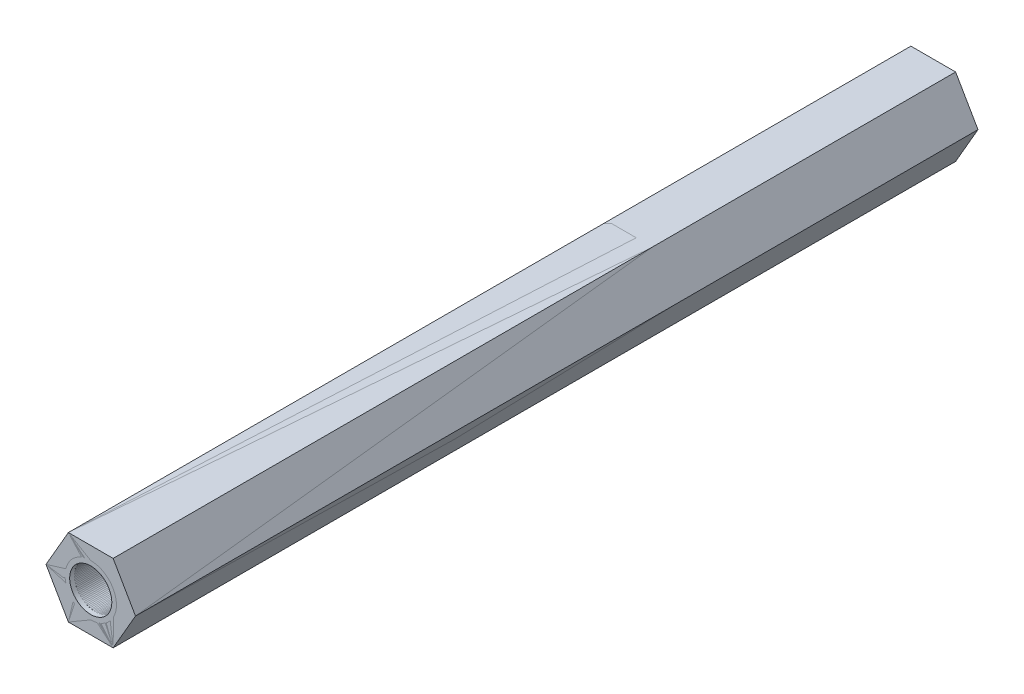
ISO-10303-21;
HEADER;
FILE_DESCRIPTION(('STEP AP214'),'2;1');
FILE_NAME('part.step','',(''),(''),'','','');
FILE_SCHEMA(('AUTOMOTIVE_DESIGN { 1 0 10303 214 1 1 1 1 }'));
ENDSEC;
DATA;
#1=APPLICATION_CONTEXT('core data for automotive mechanical design processes');
#2=APPLICATION_PROTOCOL_DEFINITION('international standard','automotive_design',2000,#1);
#3=PRODUCT_CONTEXT('',#1,'mechanical');
#4=PRODUCT('Part','Part','',(#3));
#5=PRODUCT_RELATED_PRODUCT_CATEGORY('part','',(#4));
#6=PRODUCT_DEFINITION_FORMATION('','',#4);
#7=PRODUCT_DEFINITION_CONTEXT('part definition',#1,'design');
#8=PRODUCT_DEFINITION('design','',#6,#7);
#9=PRODUCT_DEFINITION_SHAPE('','',#8);
#10=(LENGTH_UNIT() NAMED_UNIT(*) SI_UNIT(.MILLI.,.METRE.));
#11=(NAMED_UNIT(*) PLANE_ANGLE_UNIT() SI_UNIT($,.RADIAN.));
#12=(NAMED_UNIT(*) SI_UNIT($,.STERADIAN.) SOLID_ANGLE_UNIT());
#13=UNCERTAINTY_MEASURE_WITH_UNIT(LENGTH_MEASURE(1.E-05),#10,'distance_accuracy_value','');
#14=(GEOMETRIC_REPRESENTATION_CONTEXT(3) GLOBAL_UNCERTAINTY_ASSIGNED_CONTEXT((#13)) GLOBAL_UNIT_ASSIGNED_CONTEXT((#10,
#11,#12)) REPRESENTATION_CONTEXT('',''));
#15=CARTESIAN_POINT('',(0.,0.,0.));
#16=DIRECTION('',(0.,0.,1.));
#17=DIRECTION('',(1.,0.,0.));
#18=AXIS2_PLACEMENT_3D('',#15,#16,#17);
#19=CARTESIAN_POINT('',(0.,0.,15.475));
#20=DIRECTION('',(0.,0.,1.));
#21=DIRECTION('',(-1.,0.,0.));
#22=AXIS2_PLACEMENT_3D('',#19,#20,#21);
#23=CONICAL_SURFACE('',#22,1.00000000000004,0.78539816339747);
#24=DIRECTION('',(0.707106781186548,0.,0.707106781186548));
#25=VECTOR('',#24,1.);
#26=CARTESIAN_POINT('',(1.25,0.,15.725));
#27=LINE('',#26,#25);
#28=CARTESIAN_POINT('',(1.25,0.,15.725));
#29=VERTEX_POINT('',#28);
#30=CARTESIAN_POINT('',(1.525,0.,16.));
#31=VERTEX_POINT('',#30);
#32=EDGE_CURVE('P0_E172',#29,#31,#27,.T.);
#33=ORIENTED_EDGE('',*,*,#32,.F.);
#34=CARTESIAN_POINT('',(0.,0.,15.725));
#35=DIRECTION('',(0.,0.,1.));
#36=DIRECTION('',(-1.,0.,0.));
#37=AXIS2_PLACEMENT_3D('',#34,#35,#36);
#38=CIRCLE('',#37,1.25);
#39=CARTESIAN_POINT('',(-1.25,0.,15.725));
#40=VERTEX_POINT('',#39);
#41=EDGE_CURVE('P0_E183',#40,#29,#38,.T.);
#42=ORIENTED_EDGE('',*,*,#41,.F.);
#43=DIRECTION('',(0.707106781186548,0.,-0.707106781186548));
#44=VECTOR('',#43,1.);
#45=CARTESIAN_POINT('',(-1.525,0.,16.));
#46=LINE('',#45,#44);
#47=CARTESIAN_POINT('',(-1.525,0.,16.));
#48=VERTEX_POINT('',#47);
#49=EDGE_CURVE('P0_E179',#48,#40,#46,.T.);
#50=ORIENTED_EDGE('',*,*,#49,.F.);
#51=CARTESIAN_POINT('',(0.,0.,16.));
#52=DIRECTION('',(0.,0.,-1.));
#53=DIRECTION('',(1.,0.,0.));
#54=AXIS2_PLACEMENT_3D('',#51,#52,#53);
#55=CIRCLE('',#54,1.525);
#56=EDGE_CURVE('P0_E218',#31,#48,#55,.T.);
#57=ORIENTED_EDGE('',*,*,#56,.F.);
#58=EDGE_LOOP('',(#33,#42,#50,#57));
#59=FACE_BOUND('',#58,.T.);
#60=ADVANCED_FACE('P0_F17',(#59),#23,.F.);
#61=CARTESIAN_POINT('',(0.,0.,15.725));
#62=DIRECTION('',(0.,0.,-1.));
#63=DIRECTION('',(-0.999999999999514,9.85398092523794E-07,0.));
#64=AXIS2_PLACEMENT_3D('',#61,#62,#63);
#65=CYLINDRICAL_SURFACE('',#64,1.25);
#66=DIRECTION('',(0.,0.,-1.));
#67=VECTOR('',#66,1.);
#68=CARTESIAN_POINT('',(1.25,0.,15.725));
#69=LINE('',#68,#67);
#70=CARTESIAN_POINT('',(1.25,0.,3.5));
#71=VERTEX_POINT('',#70);
#72=EDGE_CURVE('P0_E187',#29,#71,#69,.T.);
#73=ORIENTED_EDGE('',*,*,#72,.F.);
#74=CARTESIAN_POINT('',(0.,0.,15.725));
#75=DIRECTION('',(0.,0.,-1.));
#76=DIRECTION('',(-1.,0.,0.));
#77=AXIS2_PLACEMENT_3D('',#74,#75,#76);
#78=CIRCLE('',#77,1.25);
#79=EDGE_CURVE('P0_E170',#40,#29,#78,.T.);
#80=ORIENTED_EDGE('',*,*,#79,.F.);
#81=DIRECTION('',(0.,0.,1.));
#82=VECTOR('',#81,1.);
#83=CARTESIAN_POINT('',(-1.25,0.,3.5));
#84=LINE('',#83,#82);
#85=CARTESIAN_POINT('',(-1.25,0.,3.5));
#86=VERTEX_POINT('',#85);
#87=EDGE_CURVE('P0_E203',#86,#40,#84,.T.);
#88=ORIENTED_EDGE('',*,*,#87,.F.);
#89=CARTESIAN_POINT('',(0.,0.,3.5));
#90=DIRECTION('',(0.,0.,1.));
#91=DIRECTION('',(1.,0.,0.));
#92=AXIS2_PLACEMENT_3D('',#89,#90,#91);
#93=CIRCLE('',#92,1.25);
#94=EDGE_CURVE('P0_E209',#71,#86,#93,.T.);
#95=ORIENTED_EDGE('',*,*,#94,.F.);
#96=EDGE_LOOP('',(#73,#80,#88,#95));
#97=FACE_BOUND('',#96,.T.);
#98=ADVANCED_FACE('P0_F467',(#97),#65,.F.);
#99=CARTESIAN_POINT('',(0.,0.,3.7489242262156));
#100=DIRECTION('',(0.,0.,1.));
#101=DIRECTION('',(-1.,0.,0.));
#102=AXIS2_PLACEMENT_3D('',#99,#100,#101);
#103=CONICAL_SURFACE('',#102,1.66427948235069,1.0297442586767);
#104=DIRECTION('',(0.857167300702128,0.,0.515038074910029));
#105=VECTOR('',#104,1.);
#106=CARTESIAN_POINT('',(0.,0.,2.7489242262156));
#107=LINE('',#106,#105);
#108=CARTESIAN_POINT('',(0.,0.,2.7489242262156));
#109=VERTEX_POINT('',#108);
#110=EDGE_CURVE('P0_E202',#109,#71,#107,.T.);
#111=ORIENTED_EDGE('',*,*,#110,.F.);
#112=DIRECTION('',(0.857167300702128,0.,-0.515038074910029));
#113=VECTOR('',#112,1.);
#114=CARTESIAN_POINT('',(-1.25,0.,3.5));
#115=LINE('',#114,#113);
#116=EDGE_CURVE('P0_E198',#86,#109,#115,.T.);
#117=ORIENTED_EDGE('',*,*,#116,.F.);
#118=CARTESIAN_POINT('',(0.,0.,3.5));
#119=DIRECTION('',(0.,0.,-1.));
#120=DIRECTION('',(1.,0.,0.));
#121=AXIS2_PLACEMENT_3D('',#118,#119,#120);
#122=CIRCLE('',#121,1.25);
#123=EDGE_CURVE('P0_E197',#71,#86,#122,.T.);
#124=ORIENTED_EDGE('',*,*,#123,.F.);
#125=EDGE_LOOP('',(#111,#117,#124));
#126=FACE_BOUND('',#125,.T.);
#127=ADVANCED_FACE('P0_F472',(#126),#103,.F.);
#128=CARTESIAN_POINT('',(0.,0.,-15.475));
#129=DIRECTION('',(0.,0.,-1.));
#130=DIRECTION('',(1.,0.,0.));
#131=AXIS2_PLACEMENT_3D('',#128,#129,#130);
#132=CONICAL_SURFACE('',#131,1.00000000000004,0.78539816339747);
#133=DIRECTION('',(-0.707106781186548,0.,-0.707106781186548));
#134=VECTOR('',#133,1.);
#135=CARTESIAN_POINT('',(-1.25,0.,-15.725));
#136=LINE('',#135,#134);
#137=CARTESIAN_POINT('',(-1.25,0.,-15.725));
#138=VERTEX_POINT('',#137);
#139=CARTESIAN_POINT('',(-1.525,0.,-16.));
#140=VERTEX_POINT('',#139);
#141=EDGE_CURVE('P0_E159',#138,#140,#136,.T.);
#142=ORIENTED_EDGE('',*,*,#141,.F.);
#143=CARTESIAN_POINT('',(0.,0.,-15.725));
#144=DIRECTION('',(0.,0.,-1.));
#145=DIRECTION('',(1.,0.,0.));
#146=AXIS2_PLACEMENT_3D('',#143,#144,#145);
#147=CIRCLE('',#146,1.25);
#148=CARTESIAN_POINT('',(1.25,0.,-15.725));
#149=VERTEX_POINT('',#148);
#150=EDGE_CURVE('P0_E152',#149,#138,#147,.T.);
#151=ORIENTED_EDGE('',*,*,#150,.F.);
#152=DIRECTION('',(-0.707106781186548,0.,0.707106781186548));
#153=VECTOR('',#152,1.);
#154=CARTESIAN_POINT('',(1.525,0.,-16.));
#155=LINE('',#154,#153);
#156=CARTESIAN_POINT('',(1.525,0.,-16.));
#157=VERTEX_POINT('',#156);
#158=EDGE_CURVE('P0_E149',#157,#149,#155,.T.);
#159=ORIENTED_EDGE('',*,*,#158,.F.);
#160=CARTESIAN_POINT('',(0.,0.,-16.));
#161=DIRECTION('',(0.,0.,1.));
#162=DIRECTION('',(-1.,0.,0.));
#163=AXIS2_PLACEMENT_3D('',#160,#161,#162);
#164=CIRCLE('',#163,1.525);
#165=EDGE_CURVE('P0_E11',#140,#157,#164,.T.);
#166=ORIENTED_EDGE('',*,*,#165,.F.);
#167=EDGE_LOOP('',(#142,#151,#159,#166));
#168=FACE_BOUND('',#167,.T.);
#169=ADVANCED_FACE('P0_F150',(#168),#132,.F.);
#170=CARTESIAN_POINT('',(0.,0.,-15.725));
#171=DIRECTION('',(0.,0.,1.));
#172=DIRECTION('',(0.999999999999514,9.85398092523794E-07,0.));
#173=AXIS2_PLACEMENT_3D('',#170,#171,#172);
#174=CYLINDRICAL_SURFACE('',#173,1.25);
#175=DIRECTION('',(0.,0.,1.));
#176=VECTOR('',#175,1.);
#177=CARTESIAN_POINT('',(-1.25,0.,-15.725));
#178=LINE('',#177,#176);
#179=CARTESIAN_POINT('',(-1.25,0.,-3.5));
#180=VERTEX_POINT('',#179);
#181=EDGE_CURVE('P0_E214',#138,#180,#178,.T.);
#182=ORIENTED_EDGE('',*,*,#181,.F.);
#183=CARTESIAN_POINT('',(0.,0.,-15.725));
#184=DIRECTION('',(0.,0.,1.));
#185=DIRECTION('',(1.,0.,0.));
#186=AXIS2_PLACEMENT_3D('',#183,#184,#185);
#187=CIRCLE('',#186,1.25);
#188=EDGE_CURVE('P0_E166',#149,#138,#187,.T.);
#189=ORIENTED_EDGE('',*,*,#188,.F.);
#190=DIRECTION('',(0.,0.,-1.));
#191=VECTOR('',#190,1.);
#192=CARTESIAN_POINT('',(1.25,0.,-3.5));
#193=LINE('',#192,#191);
#194=CARTESIAN_POINT('',(1.25,0.,-3.5));
#195=VERTEX_POINT('',#194);
#196=EDGE_CURVE('P0_E232',#195,#149,#193,.T.);
#197=ORIENTED_EDGE('',*,*,#196,.F.);
#198=CARTESIAN_POINT('',(0.,0.,-3.5));
#199=DIRECTION('',(0.,0.,-1.));
#200=DIRECTION('',(-1.,0.,0.));
#201=AXIS2_PLACEMENT_3D('',#198,#199,#200);
#202=CIRCLE('',#201,1.25);
#203=EDGE_CURVE('P0_E243',#180,#195,#202,.T.);
#204=ORIENTED_EDGE('',*,*,#203,.F.);
#205=EDGE_LOOP('',(#182,#189,#197,#204));
#206=FACE_BOUND('',#205,.T.);
#207=ADVANCED_FACE('P0_F432',(#206),#174,.F.);
#208=CARTESIAN_POINT('',(0.,0.,-3.7489242262156));
#209=DIRECTION('',(0.,0.,-1.));
#210=DIRECTION('',(1.,0.,0.));
#211=AXIS2_PLACEMENT_3D('',#208,#209,#210);
#212=CONICAL_SURFACE('',#211,1.66427948235069,1.0297442586767);
#213=DIRECTION('',(-0.857167300702128,0.,-0.515038074910029));
#214=VECTOR('',#213,1.);
#215=CARTESIAN_POINT('',(0.,0.,-2.7489242262156));
#216=LINE('',#215,#214);
#217=CARTESIAN_POINT('',(0.,0.,-2.7489242262156));
#218=VERTEX_POINT('',#217);
#219=EDGE_CURVE('P0_E239',#218,#180,#216,.T.);
#220=ORIENTED_EDGE('',*,*,#219,.F.);
#221=DIRECTION('',(-0.857167300702128,0.,0.515038074910029));
#222=VECTOR('',#221,1.);
#223=CARTESIAN_POINT('',(1.25,0.,-3.5));
#224=LINE('',#223,#222);
#225=EDGE_CURVE('P0_E235',#195,#218,#224,.T.);
#226=ORIENTED_EDGE('',*,*,#225,.F.);
#227=CARTESIAN_POINT('',(0.,0.,-3.5));
#228=DIRECTION('',(0.,0.,1.));
#229=DIRECTION('',(-1.,0.,0.));
#230=AXIS2_PLACEMENT_3D('',#227,#228,#229);
#231=CIRCLE('',#230,1.25);
#232=EDGE_CURVE('P0_E222',#180,#195,#231,.T.);
#233=ORIENTED_EDGE('',*,*,#232,.F.);
#234=EDGE_LOOP('',(#220,#226,#233));
#235=FACE_BOUND('',#234,.T.);
#236=ADVANCED_FACE('P0_F391',(#235),#212,.F.);
#237=CARTESIAN_POINT('',(0.,0.,-16.));
#238=DIRECTION('',(0.,0.,-1.));
#239=DIRECTION('',(0.,-1.,0.));
#240=AXIS2_PLACEMENT_3D('',#237,#238,#239);
#241=PLANE('',#240);
#242=CARTESIAN_POINT('',(0.,0.,-16.));
#243=DIRECTION('',(0.,0.,-1.));
#244=DIRECTION('',(-1.,0.,0.));
#245=AXIS2_PLACEMENT_3D('',#242,#243,#244);
#246=CIRCLE('',#245,1.525);
#247=EDGE_CURVE('P0_E143',#140,#157,#246,.T.);
#248=ORIENTED_EDGE('',*,*,#247,.F.);
#249=ORIENTED_EDGE('',*,*,#165,.T.);
#250=EDGE_LOOP('',(#248,#249));
#251=FACE_BOUND('',#250,.T.);
#252=DIRECTION('',(0.499999999999988,0.866025403784446,0.));
#253=VECTOR('',#252,1.);
#254=CARTESIAN_POINT('',(1.3279056191362,-2.3,-16.));
#255=LINE('',#254,#253);
#256=CARTESIAN_POINT('',(1.3279056191362,-2.3,-16.));
#257=VERTEX_POINT('',#256);
#258=CARTESIAN_POINT('',(2.6558112382723,0.,-16.));
#259=VERTEX_POINT('',#258);
#260=EDGE_CURVE('P0_E281',#257,#259,#255,.T.);
#261=ORIENTED_EDGE('',*,*,#260,.F.);
#262=DIRECTION('',(1.,0.,0.));
#263=VECTOR('',#262,1.);
#264=CARTESIAN_POINT('',(-1.3279056191361,-2.3,-16.));
#265=LINE('',#264,#263);
#266=CARTESIAN_POINT('',(-1.3279056191361,-2.3,-16.));
#267=VERTEX_POINT('',#266);
#268=EDGE_CURVE('P0_E249',#267,#257,#265,.T.);
#269=ORIENTED_EDGE('',*,*,#268,.F.);
#270=DIRECTION('',(0.500000000000019,-0.866025403784428,0.));
#271=VECTOR('',#270,1.);
#272=CARTESIAN_POINT('',(-2.6558112382723,0.,-16.));
#273=LINE('',#272,#271);
#274=CARTESIAN_POINT('',(-2.6558112382723,0.,-16.));
#275=VERTEX_POINT('',#274);
#276=EDGE_CURVE('P0_E272',#275,#267,#273,.T.);
#277=ORIENTED_EDGE('',*,*,#276,.F.);
#278=DIRECTION('',(-0.500000000000011,-0.866025403784432,0.));
#279=VECTOR('',#278,1.);
#280=CARTESIAN_POINT('',(-1.3279056191361,2.3,-16.));
#281=LINE('',#280,#279);
#282=CARTESIAN_POINT('',(-1.3279056191361,2.3,-16.));
#283=VERTEX_POINT('',#282);
#284=EDGE_CURVE('P0_E20',#283,#275,#281,.T.);
#285=ORIENTED_EDGE('',*,*,#284,.F.);
#286=DIRECTION('',(-1.,0.,0.));
#287=VECTOR('',#286,1.);
#288=CARTESIAN_POINT('',(1.3279056191361,2.3,-16.));
#289=LINE('',#288,#287);
#290=CARTESIAN_POINT('',(1.3279056191361,2.3,-16.));
#291=VERTEX_POINT('',#290);
#292=EDGE_CURVE('P0_E43',#291,#283,#289,.T.);
#293=ORIENTED_EDGE('',*,*,#292,.F.);
#294=DIRECTION('',(-0.500000000000019,0.866025403784428,0.));
#295=VECTOR('',#294,1.);
#296=CARTESIAN_POINT('',(2.6558112382723,0.,-16.));
#297=LINE('',#296,#295);
#298=EDGE_CURVE('P0_E223',#259,#291,#297,.T.);
#299=ORIENTED_EDGE('',*,*,#298,.F.);
#300=EDGE_LOOP('',(#261,#269,#277,#285,#293,#299));
#301=FACE_BOUND('',#300,.T.);
#302=ADVANCED_FACE('P0_F141',(#251,#301),#241,.T.);
#303=CARTESIAN_POINT('',(-1.9918584287042,1.15,0.));
#304=DIRECTION('',(-0.866025403784439,0.5,0.));
#305=DIRECTION('',(0.,0.,1.));
#306=AXIS2_PLACEMENT_3D('',#303,#304,#305);
#307=PLANE('',#306);
#308=ORIENTED_EDGE('',*,*,#284,.T.);
#309=DIRECTION('',(0.,0.,-1.));
#310=VECTOR('',#309,1.);
#311=CARTESIAN_POINT('',(-2.6558112382723,0.,16.));
#312=LINE('',#311,#310);
#313=CARTESIAN_POINT('',(-2.6558112382723,0.,16.));
#314=VERTEX_POINT('',#313);
#315=EDGE_CURVE('P0_E275',#314,#275,#312,.T.);
#316=ORIENTED_EDGE('',*,*,#315,.F.);
#317=DIRECTION('',(-0.500000000000011,-0.866025403784432,0.));
#318=VECTOR('',#317,1.);
#319=CARTESIAN_POINT('',(-1.3279056191361,2.3,16.));
#320=LINE('',#319,#318);
#321=CARTESIAN_POINT('',(-1.3279056191361,2.3,16.));
#322=VERTEX_POINT('',#321);
#323=EDGE_CURVE('P0_E192',#322,#314,#320,.T.);
#324=ORIENTED_EDGE('',*,*,#323,.F.);
#325=DIRECTION('',(0.,0.,1.));
#326=VECTOR('',#325,1.);
#327=CARTESIAN_POINT('',(-1.3279056191361,2.3,-16.));
#328=LINE('',#327,#326);
#329=EDGE_CURVE('P0_E289',#283,#322,#328,.T.);
#330=ORIENTED_EDGE('',*,*,#329,.F.);
#331=EDGE_LOOP('',(#308,#316,#324,#330));
#332=FACE_BOUND('',#331,.T.);
#333=ADVANCED_FACE('P0_F314',(#332),#307,.T.);
#334=CARTESIAN_POINT('',(0.,2.3,0.));
#335=DIRECTION('',(0.,1.,0.));
#336=DIRECTION('',(1.,0.,0.));
#337=AXIS2_PLACEMENT_3D('',#334,#335,#336);
#338=PLANE('',#337);
#339=ORIENTED_EDGE('',*,*,#292,.T.);
#340=ORIENTED_EDGE('',*,*,#329,.T.);
#341=DIRECTION('',(-1.,0.,0.));
#342=VECTOR('',#341,1.);
#343=CARTESIAN_POINT('',(1.3279056191361,2.3,16.));
#344=LINE('',#343,#342);
#345=CARTESIAN_POINT('',(1.3279056191361,2.3,16.));
#346=VERTEX_POINT('',#345);
#347=EDGE_CURVE('P0_E188',#346,#322,#344,.T.);
#348=ORIENTED_EDGE('',*,*,#347,.F.);
#349=DIRECTION('',(0.,0.,1.));
#350=VECTOR('',#349,1.);
#351=CARTESIAN_POINT('',(1.3279056191361,2.3,-16.));
#352=LINE('',#351,#350);
#353=EDGE_CURVE('P0_E227',#291,#346,#352,.T.);
#354=ORIENTED_EDGE('',*,*,#353,.F.);
#355=EDGE_LOOP('',(#339,#340,#348,#354));
#356=FACE_BOUND('',#355,.T.);
#357=ADVANCED_FACE('P0_F295',(#356),#338,.T.);
#358=CARTESIAN_POINT('',(1.9918584287042,1.15,0.));
#359=DIRECTION('',(0.866025403784439,0.5,0.));
#360=DIRECTION('',(0.,0.,-1.));
#361=AXIS2_PLACEMENT_3D('',#358,#359,#360);
#362=PLANE('',#361);
#363=ORIENTED_EDGE('',*,*,#298,.T.);
#364=ORIENTED_EDGE('',*,*,#353,.T.);
#365=DIRECTION('',(-0.500000000000019,0.866025403784428,0.));
#366=VECTOR('',#365,1.);
#367=CARTESIAN_POINT('',(2.6558112382723,0.,16.));
#368=LINE('',#367,#366);
#369=CARTESIAN_POINT('',(2.6558112382723,0.,16.));
#370=VERTEX_POINT('',#369);
#371=EDGE_CURVE('P0_E193',#370,#346,#368,.T.);
#372=ORIENTED_EDGE('',*,*,#371,.F.);
#373=DIRECTION('',(0.,0.,1.));
#374=VECTOR('',#373,1.);
#375=CARTESIAN_POINT('',(2.6558112382723,0.,-16.));
#376=LINE('',#375,#374);
#377=EDGE_CURVE('P0_E228',#259,#370,#376,.T.);
#378=ORIENTED_EDGE('',*,*,#377,.F.);
#379=EDGE_LOOP('',(#363,#364,#372,#378));
#380=FACE_BOUND('',#379,.T.);
#381=ADVANCED_FACE('P0_F301',(#380),#362,.T.);
#382=CARTESIAN_POINT('',(1.9918584287042,-1.15,0.));
#383=DIRECTION('',(0.866025403784443,-0.499999999999992,0.));
#384=DIRECTION('',(0.,0.,-1.));
#385=AXIS2_PLACEMENT_3D('',#382,#383,#384);
#386=PLANE('',#385);
#387=ORIENTED_EDGE('',*,*,#260,.T.);
#388=ORIENTED_EDGE('',*,*,#377,.T.);
#389=DIRECTION('',(0.499999999999988,0.866025403784446,0.));
#390=VECTOR('',#389,1.);
#391=CARTESIAN_POINT('',(1.3279056191362,-2.3,16.));
#392=LINE('',#391,#390);
#393=CARTESIAN_POINT('',(1.3279056191362,-2.3,16.));
#394=VERTEX_POINT('',#393);
#395=EDGE_CURVE('P0_E262',#394,#370,#392,.T.);
#396=ORIENTED_EDGE('',*,*,#395,.F.);
#397=DIRECTION('',(0.,0.,1.));
#398=VECTOR('',#397,1.);
#399=CARTESIAN_POINT('',(1.3279056191362,-2.3,-16.));
#400=LINE('',#399,#398);
#401=EDGE_CURVE('P0_E244',#257,#394,#400,.T.);
#402=ORIENTED_EDGE('',*,*,#401,.F.);
#403=EDGE_LOOP('',(#387,#388,#396,#402));
#404=FACE_BOUND('',#403,.T.);
#405=ADVANCED_FACE('P0_F305',(#404),#386,.T.);
#406=CARTESIAN_POINT('',(-1.9918584287042,-1.15,0.));
#407=DIRECTION('',(-0.866025403784432,-0.500000000000011,0.));
#408=DIRECTION('',(-0.500000000000011,0.866025403784432,0.));
#409=AXIS2_PLACEMENT_3D('',#406,#407,#408);
#410=PLANE('',#409);
#411=ORIENTED_EDGE('',*,*,#276,.T.);
#412=DIRECTION('',(0.,0.,-1.));
#413=VECTOR('',#412,1.);
#414=CARTESIAN_POINT('',(-1.3279056191361,-2.3,16.));
#415=LINE('',#414,#413);
#416=CARTESIAN_POINT('',(-1.3279056191361,-2.3,16.));
#417=VERTEX_POINT('',#416);
#418=EDGE_CURVE('P0_E255',#417,#267,#415,.T.);
#419=ORIENTED_EDGE('',*,*,#418,.F.);
#420=DIRECTION('',(0.500000000000019,-0.866025403784428,0.));
#421=VECTOR('',#420,1.);
#422=CARTESIAN_POINT('',(-2.6558112382723,0.,16.));
#423=LINE('',#422,#421);
#424=EDGE_CURVE('P0_E215',#314,#417,#423,.T.);
#425=ORIENTED_EDGE('',*,*,#424,.F.);
#426=ORIENTED_EDGE('',*,*,#315,.T.);
#427=EDGE_LOOP('',(#411,#419,#425,#426));
#428=FACE_BOUND('',#427,.T.);
#429=ADVANCED_FACE('P0_F312',(#428),#410,.T.);
#430=CARTESIAN_POINT('',(0.,0.,16.));
#431=DIRECTION('',(0.,0.,1.));
#432=DIRECTION('',(1.,0.,0.));
#433=AXIS2_PLACEMENT_3D('',#430,#431,#432);
#434=PLANE('',#433);
#435=CARTESIAN_POINT('',(0.,0.,16.));
#436=DIRECTION('',(0.,0.,1.));
#437=DIRECTION('',(1.,0.,0.));
#438=AXIS2_PLACEMENT_3D('',#435,#436,#437);
#439=CIRCLE('',#438,1.525);
#440=EDGE_CURVE('P0_E175',#31,#48,#439,.T.);
#441=ORIENTED_EDGE('',*,*,#440,.F.);
#442=ORIENTED_EDGE('',*,*,#56,.T.);
#443=EDGE_LOOP('',(#441,#442));
#444=FACE_BOUND('',#443,.T.);
#445=ORIENTED_EDGE('',*,*,#395,.T.);
#446=ORIENTED_EDGE('',*,*,#371,.T.);
#447=ORIENTED_EDGE('',*,*,#347,.T.);
#448=ORIENTED_EDGE('',*,*,#323,.T.);
#449=ORIENTED_EDGE('',*,*,#424,.T.);
#450=DIRECTION('',(-1.,0.,0.));
#451=VECTOR('',#450,1.);
#452=CARTESIAN_POINT('',(1.3279056191362,-2.3,16.));
#453=LINE('',#452,#451);
#454=EDGE_CURVE('P0_E248',#394,#417,#453,.T.);
#455=ORIENTED_EDGE('',*,*,#454,.F.);
#456=EDGE_LOOP('',(#445,#446,#447,#448,#449,#455));
#457=FACE_BOUND('',#456,.T.);
#458=ADVANCED_FACE('P0_F440',(#444,#457),#434,.T.);
#459=CARTESIAN_POINT('',(0.,-2.3,0.));
#460=DIRECTION('',(0.,-1.,0.));
#461=DIRECTION('',(0.,0.,-1.));
#462=AXIS2_PLACEMENT_3D('',#459,#460,#461);
#463=PLANE('',#462);
#464=ORIENTED_EDGE('',*,*,#268,.T.);
#465=ORIENTED_EDGE('',*,*,#401,.T.);
#466=ORIENTED_EDGE('',*,*,#454,.T.);
#467=ORIENTED_EDGE('',*,*,#418,.T.);
#468=EDGE_LOOP('',(#464,#465,#466,#467));
#469=FACE_BOUND('',#468,.T.);
#470=ADVANCED_FACE('P0_F308',(#469),#463,.T.);
#471=CARTESIAN_POINT('',(0.,0.,-3.7489242262156));
#472=DIRECTION('',(0.,0.,-1.));
#473=DIRECTION('',(1.,0.,0.));
#474=AXIS2_PLACEMENT_3D('',#471,#472,#473);
#475=CONICAL_SURFACE('',#474,1.66427948235069,1.0297442586767);
#476=ORIENTED_EDGE('',*,*,#225,.T.);
#477=ORIENTED_EDGE('',*,*,#219,.T.);
#478=ORIENTED_EDGE('',*,*,#203,.T.);
#479=EDGE_LOOP('',(#476,#477,#478));
#480=FACE_BOUND('',#479,.T.);
#481=ADVANCED_FACE('P0_F411',(#480),#475,.F.);
#482=CARTESIAN_POINT('',(0.,0.,-15.725));
#483=DIRECTION('',(0.,0.,1.));
#484=DIRECTION('',(-1.,0.,0.));
#485=AXIS2_PLACEMENT_3D('',#482,#483,#484);
#486=CYLINDRICAL_SURFACE('',#485,1.25);
#487=ORIENTED_EDGE('',*,*,#150,.T.);
#488=ORIENTED_EDGE('',*,*,#181,.T.);
#489=ORIENTED_EDGE('',*,*,#232,.T.);
#490=ORIENTED_EDGE('',*,*,#196,.T.);
#491=EDGE_LOOP('',(#487,#488,#489,#490));
#492=FACE_BOUND('',#491,.T.);
#493=ADVANCED_FACE('P0_F401',(#492),#486,.F.);
#494=CARTESIAN_POINT('',(0.,0.,-15.475));
#495=DIRECTION('',(0.,0.,-1.));
#496=DIRECTION('',(1.,0.,0.));
#497=AXIS2_PLACEMENT_3D('',#494,#495,#496);
#498=CONICAL_SURFACE('',#497,1.00000000000004,0.78539816339747);
#499=ORIENTED_EDGE('',*,*,#188,.T.);
#500=ORIENTED_EDGE('',*,*,#141,.T.);
#501=ORIENTED_EDGE('',*,*,#247,.T.);
#502=ORIENTED_EDGE('',*,*,#158,.T.);
#503=EDGE_LOOP('',(#499,#500,#501,#502));
#504=FACE_BOUND('',#503,.T.);
#505=ADVANCED_FACE('P0_F158',(#504),#498,.F.);
#506=CARTESIAN_POINT('',(0.,0.,3.7489242262156));
#507=DIRECTION('',(0.,0.,1.));
#508=DIRECTION('',(-1.,0.,0.));
#509=AXIS2_PLACEMENT_3D('',#506,#507,#508);
#510=CONICAL_SURFACE('',#509,1.66427948235069,1.0297442586767);
#511=ORIENTED_EDGE('',*,*,#116,.T.);
#512=ORIENTED_EDGE('',*,*,#110,.T.);
#513=ORIENTED_EDGE('',*,*,#94,.T.);
#514=EDGE_LOOP('',(#511,#512,#513));
#515=FACE_BOUND('',#514,.T.);
#516=ADVANCED_FACE('P0_F369',(#515),#510,.F.);
#517=CARTESIAN_POINT('',(0.,0.,15.725));
#518=DIRECTION('',(0.,0.,-1.));
#519=DIRECTION('',(1.,0.,0.));
#520=AXIS2_PLACEMENT_3D('',#517,#518,#519);
#521=CYLINDRICAL_SURFACE('',#520,1.25);
#522=ORIENTED_EDGE('',*,*,#41,.T.);
#523=ORIENTED_EDGE('',*,*,#72,.T.);
#524=ORIENTED_EDGE('',*,*,#123,.T.);
#525=ORIENTED_EDGE('',*,*,#87,.T.);
#526=EDGE_LOOP('',(#522,#523,#524,#525));
#527=FACE_BOUND('',#526,.T.);
#528=ADVANCED_FACE('P0_F349',(#527),#521,.F.);
#529=CARTESIAN_POINT('',(0.,0.,15.475));
#530=DIRECTION('',(0.,0.,1.));
#531=DIRECTION('',(-1.,0.,0.));
#532=AXIS2_PLACEMENT_3D('',#529,#530,#531);
#533=CONICAL_SURFACE('',#532,1.00000000000004,0.78539816339747);
#534=ORIENTED_EDGE('',*,*,#79,.T.);
#535=ORIENTED_EDGE('',*,*,#32,.T.);
#536=ORIENTED_EDGE('',*,*,#440,.T.);
#537=ORIENTED_EDGE('',*,*,#49,.T.);
#538=EDGE_LOOP('',(#534,#535,#536,#537));
#539=FACE_BOUND('',#538,.T.);
#540=ADVANCED_FACE('P0_F344',(#539),#533,.F.);
#541=CLOSED_SHELL('',(#60,#98,#127,#169,#207,#236,#302,#333,#357,#381,#405,#429,#458,#470,#481,
#493,#505,#516,#528,#540));
#542=MANIFOLD_SOLID_BREP('P0_B1',#541);
#543=CARTESIAN_POINT('',(0.,0.,16.));
#544=DIRECTION('',(0.,0.,-1.));
#545=DIRECTION('',(1.,0.,0.));
#546=AXIS2_PLACEMENT_3D('',#543,#544,#545);
#547=CYLINDRICAL_SURFACE('',#546,1.25);
#548=CARTESIAN_POINT('',(0.,0.,-34.));
#549=DIRECTION('',(0.,0.,1.));
#550=DIRECTION('',(1.,0.,0.));
#551=AXIS2_PLACEMENT_3D('',#548,#549,#550);
#552=CIRCLE('',#551,1.25);
#553=CARTESIAN_POINT('',(1.25,0.,-34.));
#554=VERTEX_POINT('',#553);
#555=EDGE_CURVE('P1_E106',#554,#554,#552,.T.);
#556=ORIENTED_EDGE('',*,*,#555,.F.);
#557=DIRECTION('',(0.,0.,1.));
#558=VECTOR('',#557,1.);
#559=CARTESIAN_POINT('',(1.25,0.,-34.));
#560=LINE('',#559,#558);
#561=CARTESIAN_POINT('',(1.25,0.,16.));
#562=VERTEX_POINT('',#561);
#563=EDGE_CURVE('P1_E11',#554,#562,#560,.T.);
#564=ORIENTED_EDGE('',*,*,#563,.T.);
#565=CARTESIAN_POINT('',(0.,0.,16.));
#566=DIRECTION('',(0.,0.,-1.));
#567=DIRECTION('',(1.,0.,0.));
#568=AXIS2_PLACEMENT_3D('',#565,#566,#567);
#569=CIRCLE('',#568,1.25);
#570=EDGE_CURVE('P1_E117',#562,#562,#569,.T.);
#571=ORIENTED_EDGE('',*,*,#570,.F.);
#572=ORIENTED_EDGE('',*,*,#563,.F.);
#573=EDGE_LOOP('',(#556,#564,#571,#572));
#574=FACE_BOUND('',#573,.T.);
#575=ADVANCED_FACE('P1_F17',(#574),#547,.F.);
#576=CARTESIAN_POINT('',(1.9918584287042,1.15,-9.));
#577=DIRECTION('',(0.866025403784428,0.500000000000019,0.));
#578=DIRECTION('',(0.,0.,-1.));
#579=AXIS2_PLACEMENT_3D('',#576,#577,#578);
#580=PLANE('',#579);
#581=DIRECTION('',(0.,0.,1.));
#582=VECTOR('',#581,1.);
#583=CARTESIAN_POINT('',(2.6558112382723,0.,-34.));
#584=LINE('',#583,#582);
#585=CARTESIAN_POINT('',(2.6558112382723,0.,-34.));
#586=VERTEX_POINT('',#585);
#587=CARTESIAN_POINT('',(2.6558112382723,0.,16.));
#588=VERTEX_POINT('',#587);
#589=EDGE_CURVE('P1_E26',#586,#588,#584,.T.);
#590=ORIENTED_EDGE('',*,*,#589,.F.);
#591=DIRECTION('',(0.500000000000019,-0.866025403784428,0.));
#592=VECTOR('',#591,1.);
#593=CARTESIAN_POINT('',(1.3279056191361,2.3,-34.));
#594=LINE('',#593,#592);
#595=CARTESIAN_POINT('',(1.3279056191361,2.3,-34.));
#596=VERTEX_POINT('',#595);
#597=EDGE_CURVE('P1_E101',#596,#586,#594,.T.);
#598=ORIENTED_EDGE('',*,*,#597,.F.);
#599=DIRECTION('',(0.,0.,-1.));
#600=VECTOR('',#599,1.);
#601=CARTESIAN_POINT('',(1.3279056191361,2.3,16.));
#602=LINE('',#601,#600);
#603=CARTESIAN_POINT('',(1.3279056191361,2.3,16.));
#604=VERTEX_POINT('',#603);
#605=EDGE_CURVE('P1_E96',#604,#596,#602,.T.);
#606=ORIENTED_EDGE('',*,*,#605,.F.);
#607=DIRECTION('',(-0.500000000000019,0.866025403784428,0.));
#608=VECTOR('',#607,1.);
#609=CARTESIAN_POINT('',(2.6558112382723,0.,16.));
#610=LINE('',#609,#608);
#611=EDGE_CURVE('P1_E98',#588,#604,#610,.T.);
#612=ORIENTED_EDGE('',*,*,#611,.F.);
#613=EDGE_LOOP('',(#590,#598,#606,#612));
#614=FACE_BOUND('',#613,.T.);
#615=ADVANCED_FACE('P1_F19',(#614),#580,.T.);
#616=CARTESIAN_POINT('',(1.9918584287043,-1.15,-9.));
#617=DIRECTION('',(0.866025403784446,-0.499999999999988,0.));
#618=DIRECTION('',(0.,0.,-1.));
#619=AXIS2_PLACEMENT_3D('',#616,#617,#618);
#620=PLANE('',#619);
#621=DIRECTION('',(0.,0.,1.));
#622=VECTOR('',#621,1.);
#623=CARTESIAN_POINT('',(1.3279056191362,-2.3,-34.));
#624=LINE('',#623,#622);
#625=CARTESIAN_POINT('',(1.3279056191362,-2.3,-34.));
#626=VERTEX_POINT('',#625);
#627=CARTESIAN_POINT('',(1.3279056191362,-2.3,16.));
#628=VERTEX_POINT('',#627);
#629=EDGE_CURVE('P1_E140',#626,#628,#624,.T.);
#630=ORIENTED_EDGE('',*,*,#629,.F.);
#631=DIRECTION('',(-0.499999999999988,-0.866025403784446,0.));
#632=VECTOR('',#631,1.);
#633=CARTESIAN_POINT('',(2.6558112382723,0.,-34.));
#634=LINE('',#633,#632);
#635=EDGE_CURVE('P1_E154',#586,#626,#634,.T.);
#636=ORIENTED_EDGE('',*,*,#635,.F.);
#637=ORIENTED_EDGE('',*,*,#589,.T.);
#638=DIRECTION('',(0.499999999999988,0.866025403784446,0.));
#639=VECTOR('',#638,1.);
#640=CARTESIAN_POINT('',(1.3279056191362,-2.3,16.));
#641=LINE('',#640,#639);
#642=EDGE_CURVE('P1_E115',#628,#588,#641,.T.);
#643=ORIENTED_EDGE('',*,*,#642,.F.);
#644=EDGE_LOOP('',(#630,#636,#637,#643));
#645=FACE_BOUND('',#644,.T.);
#646=ADVANCED_FACE('P1_F174',(#645),#620,.T.);
#647=CARTESIAN_POINT('',(0.,-2.3,-9.));
#648=DIRECTION('',(0.,-1.,0.));
#649=DIRECTION('',(0.,0.,-1.));
#650=AXIS2_PLACEMENT_3D('',#647,#648,#649);
#651=PLANE('',#650);
#652=DIRECTION('',(0.,0.,1.));
#653=VECTOR('',#652,1.);
#654=CARTESIAN_POINT('',(-1.3279056191361,-2.3,-34.));
#655=LINE('',#654,#653);
#656=CARTESIAN_POINT('',(-1.3279056191361,-2.3,-34.));
#657=VERTEX_POINT('',#656);
#658=CARTESIAN_POINT('',(-1.3279056191361,-2.3,16.));
#659=VERTEX_POINT('',#658);
#660=EDGE_CURVE('P1_E143',#657,#659,#655,.T.);
#661=ORIENTED_EDGE('',*,*,#660,.F.);
#662=DIRECTION('',(-1.,0.,0.));
#663=VECTOR('',#662,1.);
#664=CARTESIAN_POINT('',(1.3279056191362,-2.3,-34.));
#665=LINE('',#664,#663);
#666=EDGE_CURVE('P1_E160',#626,#657,#665,.T.);
#667=ORIENTED_EDGE('',*,*,#666,.F.);
#668=ORIENTED_EDGE('',*,*,#629,.T.);
#669=DIRECTION('',(1.,0.,0.));
#670=VECTOR('',#669,1.);
#671=CARTESIAN_POINT('',(-1.3279056191361,-2.3,16.));
#672=LINE('',#671,#670);
#673=EDGE_CURVE('P1_E132',#659,#628,#672,.T.);
#674=ORIENTED_EDGE('',*,*,#673,.F.);
#675=EDGE_LOOP('',(#661,#667,#668,#674));
#676=FACE_BOUND('',#675,.T.);
#677=ADVANCED_FACE('P1_F191',(#676),#651,.T.);
#678=CARTESIAN_POINT('',(-1.9918584287042,-1.15,-9.));
#679=DIRECTION('',(-0.866025403784428,-0.500000000000019,0.));
#680=DIRECTION('',(-0.500000000000019,0.866025403784428,0.));
#681=AXIS2_PLACEMENT_3D('',#678,#679,#680);
#682=PLANE('',#681);
#683=DIRECTION('',(0.,0.,1.));
#684=VECTOR('',#683,1.);
#685=CARTESIAN_POINT('',(-2.6558112382723,0.,-34.));
#686=LINE('',#685,#684);
#687=CARTESIAN_POINT('',(-2.6558112382723,0.,-34.));
#688=VERTEX_POINT('',#687);
#689=CARTESIAN_POINT('',(-2.6558112382723,0.,16.));
#690=VERTEX_POINT('',#689);
#691=EDGE_CURVE('P1_E149',#688,#690,#686,.T.);
#692=ORIENTED_EDGE('',*,*,#691,.F.);
#693=DIRECTION('',(-0.500000000000019,0.866025403784428,0.));
#694=VECTOR('',#693,1.);
#695=CARTESIAN_POINT('',(-1.3279056191361,-2.3,-34.));
#696=LINE('',#695,#694);
#697=EDGE_CURVE('P1_E164',#657,#688,#696,.T.);
#698=ORIENTED_EDGE('',*,*,#697,.F.);
#699=ORIENTED_EDGE('',*,*,#660,.T.);
#700=DIRECTION('',(0.500000000000019,-0.866025403784428,0.));
#701=VECTOR('',#700,1.);
#702=CARTESIAN_POINT('',(-2.6558112382723,0.,16.));
#703=LINE('',#702,#701);
#704=EDGE_CURVE('P1_E126',#690,#659,#703,.T.);
#705=ORIENTED_EDGE('',*,*,#704,.F.);
#706=EDGE_LOOP('',(#692,#698,#699,#705));
#707=FACE_BOUND('',#706,.T.);
#708=ADVANCED_FACE('P1_F188',(#707),#682,.T.);
#709=CARTESIAN_POINT('',(-1.9918584287042,1.15,-9.));
#710=DIRECTION('',(-0.866025403784432,0.500000000000011,0.));
#711=DIRECTION('',(0.,0.,1.));
#712=AXIS2_PLACEMENT_3D('',#709,#710,#711);
#713=PLANE('',#712);
#714=DIRECTION('',(0.,0.,1.));
#715=VECTOR('',#714,1.);
#716=CARTESIAN_POINT('',(-1.3279056191361,2.3,-34.));
#717=LINE('',#716,#715);
#718=CARTESIAN_POINT('',(-1.3279056191361,2.3,-34.));
#719=VERTEX_POINT('',#718);
#720=CARTESIAN_POINT('',(-1.3279056191361,2.3,16.));
#721=VERTEX_POINT('',#720);
#722=EDGE_CURVE('P1_E46',#719,#721,#717,.T.);
#723=ORIENTED_EDGE('',*,*,#722,.F.);
#724=DIRECTION('',(0.500000000000011,0.866025403784432,0.));
#725=VECTOR('',#724,1.);
#726=CARTESIAN_POINT('',(-2.6558112382723,0.,-34.));
#727=LINE('',#726,#725);
#728=EDGE_CURVE('P1_E167',#688,#719,#727,.T.);
#729=ORIENTED_EDGE('',*,*,#728,.F.);
#730=ORIENTED_EDGE('',*,*,#691,.T.);
#731=DIRECTION('',(-0.500000000000011,-0.866025403784432,0.));
#732=VECTOR('',#731,1.);
#733=CARTESIAN_POINT('',(-1.3279056191361,2.3,16.));
#734=LINE('',#733,#732);
#735=EDGE_CURVE('P1_E121',#721,#690,#734,.T.);
#736=ORIENTED_EDGE('',*,*,#735,.F.);
#737=EDGE_LOOP('',(#723,#729,#730,#736));
#738=FACE_BOUND('',#737,.T.);
#739=ADVANCED_FACE('P1_F185',(#738),#713,.T.);
#740=CARTESIAN_POINT('',(0.,2.3,-9.));
#741=DIRECTION('',(0.,1.,0.));
#742=DIRECTION('',(1.,0.,0.));
#743=AXIS2_PLACEMENT_3D('',#740,#741,#742);
#744=PLANE('',#743);
#745=ORIENTED_EDGE('',*,*,#605,.T.);
#746=DIRECTION('',(1.,0.,0.));
#747=VECTOR('',#746,1.);
#748=CARTESIAN_POINT('',(-1.3279056191361,2.3,-34.));
#749=LINE('',#748,#747);
#750=EDGE_CURVE('P1_E129',#719,#596,#749,.T.);
#751=ORIENTED_EDGE('',*,*,#750,.F.);
#752=ORIENTED_EDGE('',*,*,#722,.T.);
#753=DIRECTION('',(-1.,0.,0.));
#754=VECTOR('',#753,1.);
#755=CARTESIAN_POINT('',(1.3279056191361,2.3,16.));
#756=LINE('',#755,#754);
#757=EDGE_CURVE('P1_E112',#604,#721,#756,.T.);
#758=ORIENTED_EDGE('',*,*,#757,.F.);
#759=EDGE_LOOP('',(#745,#751,#752,#758));
#760=FACE_BOUND('',#759,.T.);
#761=ADVANCED_FACE('P1_F119',(#760),#744,.T.);
#762=CARTESIAN_POINT('',(0.,0.3558112382723,-34.));
#763=DIRECTION('',(0.,0.,-1.));
#764=DIRECTION('',(0.,-1.,0.));
#765=AXIS2_PLACEMENT_3D('',#762,#763,#764);
#766=PLANE('',#765);
#767=ORIENTED_EDGE('',*,*,#555,.T.);
#768=EDGE_LOOP('',(#767));
#769=FACE_BOUND('',#768,.T.);
#770=ORIENTED_EDGE('',*,*,#597,.T.);
#771=ORIENTED_EDGE('',*,*,#635,.T.);
#772=ORIENTED_EDGE('',*,*,#666,.T.);
#773=ORIENTED_EDGE('',*,*,#697,.T.);
#774=ORIENTED_EDGE('',*,*,#728,.T.);
#775=ORIENTED_EDGE('',*,*,#750,.T.);
#776=EDGE_LOOP('',(#770,#771,#772,#773,#774,#775));
#777=FACE_BOUND('',#776,.T.);
#778=ADVANCED_FACE('P1_F177',(#769,#777),#766,.T.);
#779=CARTESIAN_POINT('',(0.,0.3558112382723,16.));
#780=DIRECTION('',(0.,0.,1.));
#781=DIRECTION('',(1.,0.,0.));
#782=AXIS2_PLACEMENT_3D('',#779,#780,#781);
#783=PLANE('',#782);
#784=ORIENTED_EDGE('',*,*,#570,.T.);
#785=EDGE_LOOP('',(#784));
#786=FACE_BOUND('',#785,.T.);
#787=ORIENTED_EDGE('',*,*,#757,.T.);
#788=ORIENTED_EDGE('',*,*,#735,.T.);
#789=ORIENTED_EDGE('',*,*,#704,.T.);
#790=ORIENTED_EDGE('',*,*,#673,.T.);
#791=ORIENTED_EDGE('',*,*,#642,.T.);
#792=ORIENTED_EDGE('',*,*,#611,.T.);
#793=EDGE_LOOP('',(#787,#788,#789,#790,#791,#792));
#794=FACE_BOUND('',#793,.T.);
#795=ADVANCED_FACE('P1_F110',(#786,#794),#783,.T.);
#796=CLOSED_SHELL('',(#575,#615,#646,#677,#708,#739,#761,#778,#795));
#797=MANIFOLD_SOLID_BREP('P1_B1',#796);
#798=ADVANCED_BREP_SHAPE_REPRESENTATION('',(#18,#542,#797),#14);
#799=SHAPE_DEFINITION_REPRESENTATION(#9,#798);
ENDSEC;
END-ISO-10303-21;
